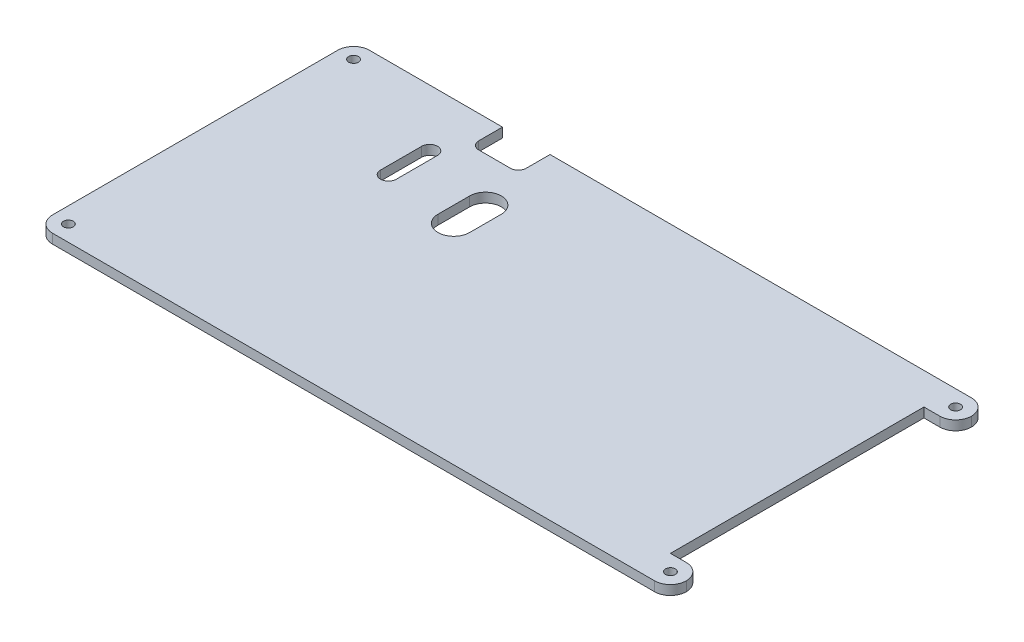
ISO-10303-21;
HEADER;
FILE_DESCRIPTION(('STEP AP214'),'2;1');
FILE_NAME('part.step','',(''),(''),'','','');
FILE_SCHEMA(('AUTOMOTIVE_DESIGN { 1 0 10303 214 1 1 1 1 }'));
ENDSEC;
DATA;
#1=APPLICATION_CONTEXT('core data for automotive mechanical design processes');
#2=APPLICATION_PROTOCOL_DEFINITION('international standard','automotive_design',2000,#1);
#3=PRODUCT_CONTEXT('',#1,'mechanical');
#4=PRODUCT('Part','Part','',(#3));
#5=PRODUCT_RELATED_PRODUCT_CATEGORY('part','',(#4));
#6=PRODUCT_DEFINITION_FORMATION('','',#4);
#7=PRODUCT_DEFINITION_CONTEXT('part definition',#1,'design');
#8=PRODUCT_DEFINITION('design','',#6,#7);
#9=PRODUCT_DEFINITION_SHAPE('','',#8);
#10=(LENGTH_UNIT() NAMED_UNIT(*) SI_UNIT(.MILLI.,.METRE.));
#11=(NAMED_UNIT(*) PLANE_ANGLE_UNIT() SI_UNIT($,.RADIAN.));
#12=(NAMED_UNIT(*) SI_UNIT($,.STERADIAN.) SOLID_ANGLE_UNIT());
#13=UNCERTAINTY_MEASURE_WITH_UNIT(LENGTH_MEASURE(1.E-05),#10,'distance_accuracy_value','');
#14=(GEOMETRIC_REPRESENTATION_CONTEXT(3) GLOBAL_UNCERTAINTY_ASSIGNED_CONTEXT((#13)) GLOBAL_UNIT_ASSIGNED_CONTEXT((#10,
#11,#12)) REPRESENTATION_CONTEXT('',''));
#15=CARTESIAN_POINT('',(0.,0.,0.));
#16=DIRECTION('',(0.,0.,1.));
#17=DIRECTION('',(1.,0.,0.));
#18=AXIS2_PLACEMENT_3D('',#15,#16,#17);
#19=CARTESIAN_POINT('',(-100.,3.,-50.));
#20=DIRECTION('',(0.,0.,-1.));
#21=DIRECTION('',(-1.,0.,0.));
#22=AXIS2_PLACEMENT_3D('',#19,#20,#21);
#23=PLANE('',#22);
#24=DIRECTION('',(0.,1.,0.));
#25=VECTOR('',#24,1.);
#26=CARTESIAN_POINT('',(-38.,0.,-50.));
#27=LINE('',#26,#25);
#28=CARTESIAN_POINT('',(-38.,0.,-50.));
#29=VERTEX_POINT('',#28);
#30=CARTESIAN_POINT('',(-38.,3.,-50.));
#31=VERTEX_POINT('',#30);
#32=EDGE_CURVE('E394',#29,#31,#27,.T.);
#33=ORIENTED_EDGE('',*,*,#32,.T.);
#34=DIRECTION('',(1.,0.,0.));
#35=VECTOR('',#34,1.);
#36=CARTESIAN_POINT('',(-100.,3.,-50.));
#37=LINE('',#36,#35);
#38=CARTESIAN_POINT('',(95.,3.,-50.));
#39=VERTEX_POINT('',#38);
#40=EDGE_CURVE('E426',#31,#39,#37,.T.);
#41=ORIENTED_EDGE('',*,*,#40,.T.);
#42=DIRECTION('',(0.,-1.,0.));
#43=VECTOR('',#42,1.);
#44=CARTESIAN_POINT('',(95.,3.,-50.));
#45=LINE('',#44,#43);
#46=CARTESIAN_POINT('',(95.,0.,-50.));
#47=VERTEX_POINT('',#46);
#48=EDGE_CURVE('E448',#39,#47,#45,.T.);
#49=ORIENTED_EDGE('',*,*,#48,.T.);
#50=DIRECTION('',(1.,0.,0.));
#51=VECTOR('',#50,1.);
#52=CARTESIAN_POINT('',(-100.,0.,-50.));
#53=LINE('',#52,#51);
#54=EDGE_CURVE('E440',#29,#47,#53,.T.);
#55=ORIENTED_EDGE('',*,*,#54,.F.);
#56=EDGE_LOOP('',(#33,#41,#49,#55));
#57=FACE_BOUND('',#56,.T.);
#58=ADVANCED_FACE('F48',(#57),#23,.T.);
#59=CARTESIAN_POINT('',(-100.,3.,-50.));
#60=DIRECTION('',(1.,0.,0.));
#61=DIRECTION('',(0.,0.,-1.));
#62=AXIS2_PLACEMENT_3D('',#59,#60,#61);
#63=PLANE('',#62);
#64=DIRECTION('',(0.,0.,1.));
#65=VECTOR('',#64,1.);
#66=CARTESIAN_POINT('',(-100.,0.,-50.));
#67=LINE('',#66,#65);
#68=CARTESIAN_POINT('',(-100.,0.,-45.));
#69=VERTEX_POINT('',#68);
#70=CARTESIAN_POINT('',(-100.,0.,45.));
#71=VERTEX_POINT('',#70);
#72=EDGE_CURVE('E430',#69,#71,#67,.T.);
#73=ORIENTED_EDGE('',*,*,#72,.T.);
#74=DIRECTION('',(0.,-1.,0.));
#75=VECTOR('',#74,1.);
#76=CARTESIAN_POINT('',(-100.,3.,45.));
#77=LINE('',#76,#75);
#78=CARTESIAN_POINT('',(-100.,3.,45.));
#79=VERTEX_POINT('',#78);
#80=EDGE_CURVE('E276',#71,#79,#77,.F.);
#81=ORIENTED_EDGE('',*,*,#80,.T.);
#82=DIRECTION('',(0.,0.,1.));
#83=VECTOR('',#82,1.);
#84=CARTESIAN_POINT('',(-100.,3.,-50.));
#85=LINE('',#84,#83);
#86=CARTESIAN_POINT('',(-100.,3.,-45.));
#87=VERTEX_POINT('',#86);
#88=EDGE_CURVE('E445',#87,#79,#85,.T.);
#89=ORIENTED_EDGE('',*,*,#88,.F.);
#90=DIRECTION('',(0.,-1.,0.));
#91=VECTOR('',#90,1.);
#92=CARTESIAN_POINT('',(-100.,0.,-45.));
#93=LINE('',#92,#91);
#94=EDGE_CURVE('E576',#87,#69,#93,.T.);
#95=ORIENTED_EDGE('',*,*,#94,.T.);
#96=EDGE_LOOP('',(#73,#81,#89,#95));
#97=FACE_BOUND('',#96,.T.);
#98=ADVANCED_FACE('F542',(#97),#63,.F.);
#99=CARTESIAN_POINT('',(-100.,3.,50.));
#100=DIRECTION('',(0.,0.,-1.));
#101=DIRECTION('',(-1.,0.,0.));
#102=AXIS2_PLACEMENT_3D('',#99,#100,#101);
#103=PLANE('',#102);
#104=DIRECTION('',(1.,0.,0.));
#105=VECTOR('',#104,1.);
#106=CARTESIAN_POINT('',(-100.,0.,50.));
#107=LINE('',#106,#105);
#108=CARTESIAN_POINT('',(-95.,0.,50.));
#109=VERTEX_POINT('',#108);
#110=CARTESIAN_POINT('',(95.,0.,50.));
#111=VERTEX_POINT('',#110);
#112=EDGE_CURVE('E435',#109,#111,#107,.T.);
#113=ORIENTED_EDGE('',*,*,#112,.T.);
#114=DIRECTION('',(0.,-1.,0.));
#115=VECTOR('',#114,1.);
#116=CARTESIAN_POINT('',(95.,3.,50.));
#117=LINE('',#116,#115);
#118=CARTESIAN_POINT('',(95.,3.,50.));
#119=VERTEX_POINT('',#118);
#120=EDGE_CURVE('E580',#111,#119,#117,.F.);
#121=ORIENTED_EDGE('',*,*,#120,.T.);
#122=DIRECTION('',(1.,0.,0.));
#123=VECTOR('',#122,1.);
#124=CARTESIAN_POINT('',(-100.,3.,50.));
#125=LINE('',#124,#123);
#126=CARTESIAN_POINT('',(-95.,3.,50.));
#127=VERTEX_POINT('',#126);
#128=EDGE_CURVE('E427',#127,#119,#125,.T.);
#129=ORIENTED_EDGE('',*,*,#128,.F.);
#130=DIRECTION('',(0.,-1.,0.));
#131=VECTOR('',#130,1.);
#132=CARTESIAN_POINT('',(-95.,3.,50.));
#133=LINE('',#132,#131);
#134=EDGE_CURVE('E583',#127,#109,#133,.T.);
#135=ORIENTED_EDGE('',*,*,#134,.T.);
#136=EDGE_LOOP('',(#113,#121,#129,#135));
#137=FACE_BOUND('',#136,.T.);
#138=ADVANCED_FACE('F550',(#137),#103,.F.);
#139=DIRECTION('',(0.,1.,0.));
#140=VECTOR('',#139,1.);
#141=CARTESIAN_POINT('',(-53.,0.,-50.));
#142=LINE('',#141,#140);
#143=CARTESIAN_POINT('',(-53.,0.,-50.));
#144=VERTEX_POINT('',#143);
#145=CARTESIAN_POINT('',(-53.,3.,-50.));
#146=VERTEX_POINT('',#145);
#147=EDGE_CURVE('E399',#144,#146,#142,.T.);
#148=ORIENTED_EDGE('',*,*,#147,.F.);
#149=CARTESIAN_POINT('',(-95.,0.,-50.));
#150=VERTEX_POINT('',#149);
#151=EDGE_CURVE('E441',#150,#144,#53,.T.);
#152=ORIENTED_EDGE('',*,*,#151,.F.);
#153=DIRECTION('',(0.,-1.,0.));
#154=VECTOR('',#153,1.);
#155=CARTESIAN_POINT('',(-95.,3.,-50.));
#156=LINE('',#155,#154);
#157=CARTESIAN_POINT('',(-95.,3.,-50.));
#158=VERTEX_POINT('',#157);
#159=EDGE_CURVE('E425',#150,#158,#156,.F.);
#160=ORIENTED_EDGE('',*,*,#159,.T.);
#161=EDGE_CURVE('E419',#158,#146,#37,.T.);
#162=ORIENTED_EDGE('',*,*,#161,.T.);
#163=EDGE_LOOP('',(#148,#152,#160,#162));
#164=FACE_BOUND('',#163,.T.);
#165=ADVANCED_FACE('F545',(#164),#23,.T.);
#166=CARTESIAN_POINT('',(0.,3.,0.));
#167=DIRECTION('',(0.,1.,0.));
#168=DIRECTION('',(0.,0.,1.));
#169=AXIS2_PLACEMENT_3D('',#166,#167,#168);
#170=PLANE('',#169);
#171=CARTESIAN_POINT('',(95.,3.,45.));
#172=DIRECTION('',(0.,1.,0.));
#173=DIRECTION('',(0.,0.,1.));
#174=AXIS2_PLACEMENT_3D('',#171,#172,#173);
#175=CIRCLE('',#174,5.);
#176=CARTESIAN_POINT('',(100.,3.,45.));
#177=VERTEX_POINT('',#176);
#178=EDGE_CURVE('E478',#119,#177,#175,.T.);
#179=ORIENTED_EDGE('',*,*,#178,.T.);
#180=CARTESIAN_POINT('',(95.,3.,45.));
#181=DIRECTION('',(0.,1.,0.));
#182=DIRECTION('',(0.,0.,1.));
#183=AXIS2_PLACEMENT_3D('',#180,#181,#182);
#184=CIRCLE('',#183,5.);
#185=CARTESIAN_POINT('',(95.,3.,40.));
#186=VERTEX_POINT('',#185);
#187=EDGE_CURVE('E275',#177,#186,#184,.T.);
#188=ORIENTED_EDGE('',*,*,#187,.T.);
#189=DIRECTION('',(1.,0.,0.));
#190=VECTOR('',#189,1.);
#191=CARTESIAN_POINT('',(100.,3.,40.));
#192=LINE('',#191,#190);
#193=CARTESIAN_POINT('',(90.,3.,40.));
#194=VERTEX_POINT('',#193);
#195=EDGE_CURVE('E252',#194,#186,#192,.T.);
#196=ORIENTED_EDGE('',*,*,#195,.F.);
#197=DIRECTION('',(0.,0.,1.));
#198=VECTOR('',#197,1.);
#199=CARTESIAN_POINT('',(90.,3.,-40.));
#200=LINE('',#199,#198);
#201=CARTESIAN_POINT('',(90.,3.,-40.));
#202=VERTEX_POINT('',#201);
#203=EDGE_CURVE('E229',#202,#194,#200,.T.);
#204=ORIENTED_EDGE('',*,*,#203,.F.);
#205=DIRECTION('',(-1.,0.,0.));
#206=VECTOR('',#205,1.);
#207=CARTESIAN_POINT('',(100.,3.,-40.));
#208=LINE('',#207,#206);
#209=CARTESIAN_POINT('',(95.,3.,-40.));
#210=VERTEX_POINT('',#209);
#211=EDGE_CURVE('E255',#210,#202,#208,.T.);
#212=ORIENTED_EDGE('',*,*,#211,.F.);
#213=CARTESIAN_POINT('',(95.,3.,-45.));
#214=DIRECTION('',(0.,1.,0.));
#215=DIRECTION('',(0.,0.,1.));
#216=AXIS2_PLACEMENT_3D('',#213,#214,#215);
#217=CIRCLE('',#216,5.);
#218=CARTESIAN_POINT('',(100.,3.,-45.));
#219=VERTEX_POINT('',#218);
#220=EDGE_CURVE('E270',#210,#219,#217,.T.);
#221=ORIENTED_EDGE('',*,*,#220,.T.);
#222=CARTESIAN_POINT('',(95.,3.,-45.));
#223=DIRECTION('',(0.,1.,0.));
#224=DIRECTION('',(0.,0.,1.));
#225=AXIS2_PLACEMENT_3D('',#222,#223,#224);
#226=CIRCLE('',#225,5.);
#227=EDGE_CURVE('E588',#219,#39,#226,.T.);
#228=ORIENTED_EDGE('',*,*,#227,.T.);
#229=ORIENTED_EDGE('',*,*,#40,.F.);
#230=DIRECTION('',(0.,0.,-1.));
#231=VECTOR('',#230,1.);
#232=CARTESIAN_POINT('',(-38.,3.,-40.));
#233=LINE('',#232,#231);
#234=CARTESIAN_POINT('',(-38.,3.,-42.5));
#235=VERTEX_POINT('',#234);
#236=EDGE_CURVE('E358',#235,#31,#233,.T.);
#237=ORIENTED_EDGE('',*,*,#236,.F.);
#238=CARTESIAN_POINT('',(-40.5,3.,-42.5));
#239=DIRECTION('',(0.,1.,0.));
#240=DIRECTION('',(0.,0.,1.));
#241=AXIS2_PLACEMENT_3D('',#238,#239,#240);
#242=CIRCLE('',#241,2.5);
#243=CARTESIAN_POINT('',(-40.5,3.,-40.));
#244=VERTEX_POINT('',#243);
#245=EDGE_CURVE('E632',#235,#244,#242,.F.);
#246=ORIENTED_EDGE('',*,*,#245,.T.);
#247=DIRECTION('',(1.,0.,0.));
#248=VECTOR('',#247,1.);
#249=CARTESIAN_POINT('',(-53.,3.,-40.));
#250=LINE('',#249,#248);
#251=CARTESIAN_POINT('',(-50.5,3.,-40.));
#252=VERTEX_POINT('',#251);
#253=EDGE_CURVE('E402',#252,#244,#250,.T.);
#254=ORIENTED_EDGE('',*,*,#253,.F.);
#255=CARTESIAN_POINT('',(-50.5,3.,-42.5));
#256=DIRECTION('',(0.,1.,0.));
#257=DIRECTION('',(0.,0.,1.));
#258=AXIS2_PLACEMENT_3D('',#255,#256,#257);
#259=CIRCLE('',#258,2.5);
#260=CARTESIAN_POINT('',(-53.,3.,-42.5));
#261=VERTEX_POINT('',#260);
#262=EDGE_CURVE('E57',#252,#261,#259,.F.);
#263=ORIENTED_EDGE('',*,*,#262,.T.);
#264=DIRECTION('',(0.,0.,1.));
#265=VECTOR('',#264,1.);
#266=CARTESIAN_POINT('',(-53.,3.,-40.));
#267=LINE('',#266,#265);
#268=EDGE_CURVE('E407',#146,#261,#267,.T.);
#269=ORIENTED_EDGE('',*,*,#268,.F.);
#270=ORIENTED_EDGE('',*,*,#161,.F.);
#271=CARTESIAN_POINT('',(-95.,3.,-45.));
#272=DIRECTION('',(0.,1.,0.));
#273=DIRECTION('',(0.,0.,1.));
#274=AXIS2_PLACEMENT_3D('',#271,#272,#273);
#275=CIRCLE('',#274,5.);
#276=EDGE_CURVE('E471',#158,#87,#275,.T.);
#277=ORIENTED_EDGE('',*,*,#276,.T.);
#278=ORIENTED_EDGE('',*,*,#88,.T.);
#279=CARTESIAN_POINT('',(-95.,3.,45.));
#280=DIRECTION('',(0.,1.,0.));
#281=DIRECTION('',(0.,0.,1.));
#282=AXIS2_PLACEMENT_3D('',#279,#280,#281);
#283=CIRCLE('',#282,5.);
#284=EDGE_CURVE('E475',#79,#127,#283,.T.);
#285=ORIENTED_EDGE('',*,*,#284,.T.);
#286=ORIENTED_EDGE('',*,*,#128,.T.);
#287=EDGE_LOOP('',(#179,#188,#196,#204,#212,#221,#228,#229,#237,#246,#254,#263,#269,#270,#277,
#278,#285,#286));
#288=FACE_BOUND('',#287,.T.);
#289=CARTESIAN_POINT('',(-58.,3.,-32.));
#290=DIRECTION('',(0.,1.,0.));
#291=DIRECTION('',(0.,0.,1.));
#292=AXIS2_PLACEMENT_3D('',#289,#290,#291);
#293=CIRCLE('',#292,2.50000000000001);
#294=CARTESIAN_POINT('',(-55.5,3.,-32.));
#295=VERTEX_POINT('',#294);
#296=CARTESIAN_POINT('',(-60.5,3.,-32.));
#297=VERTEX_POINT('',#296);
#298=EDGE_CURVE('E259',#295,#297,#293,.T.);
#299=ORIENTED_EDGE('',*,*,#298,.F.);
#300=DIRECTION('',(0.,0.,-1.));
#301=VECTOR('',#300,1.);
#302=CARTESIAN_POINT('',(-55.5,3.,-32.));
#303=LINE('',#302,#301);
#304=CARTESIAN_POINT('',(-55.5,3.,-19.));
#305=VERTEX_POINT('',#304);
#306=EDGE_CURVE('E305',#305,#295,#303,.T.);
#307=ORIENTED_EDGE('',*,*,#306,.F.);
#308=CARTESIAN_POINT('',(-58.,3.,-19.));
#309=DIRECTION('',(0.,1.,0.));
#310=DIRECTION('',(0.,0.,1.));
#311=AXIS2_PLACEMENT_3D('',#308,#309,#310);
#312=CIRCLE('',#311,2.50000000000001);
#313=CARTESIAN_POINT('',(-60.5,3.,-19.));
#314=VERTEX_POINT('',#313);
#315=EDGE_CURVE('E310',#314,#305,#312,.T.);
#316=ORIENTED_EDGE('',*,*,#315,.F.);
#317=DIRECTION('',(0.,0.,1.));
#318=VECTOR('',#317,1.);
#319=CARTESIAN_POINT('',(-60.5,3.,-32.));
#320=LINE('',#319,#318);
#321=EDGE_CURVE('E323',#297,#314,#320,.T.);
#322=ORIENTED_EDGE('',*,*,#321,.F.);
#323=EDGE_LOOP('',(#299,#307,#316,#322));
#324=FACE_BOUND('',#323,.T.);
#325=CARTESIAN_POINT('',(-34.365,3.,-26.));
#326=DIRECTION('',(0.,1.,0.));
#327=DIRECTION('',(0.,0.,1.));
#328=AXIS2_PLACEMENT_3D('',#325,#326,#327);
#329=CIRCLE('',#328,5.);
#330=CARTESIAN_POINT('',(-29.365,3.,-26.));
#331=VERTEX_POINT('',#330);
#332=CARTESIAN_POINT('',(-39.365,3.,-26.));
#333=VERTEX_POINT('',#332);
#334=EDGE_CURVE('E304',#331,#333,#329,.T.);
#335=ORIENTED_EDGE('',*,*,#334,.F.);
#336=DIRECTION('',(0.,0.,-1.));
#337=VECTOR('',#336,1.);
#338=CARTESIAN_POINT('',(-29.365,3.,-26.));
#339=LINE('',#338,#337);
#340=CARTESIAN_POINT('',(-29.365,3.,-16.));
#341=VERTEX_POINT('',#340);
#342=EDGE_CURVE('E359',#341,#331,#339,.T.);
#343=ORIENTED_EDGE('',*,*,#342,.F.);
#344=CARTESIAN_POINT('',(-34.365,3.,-16.));
#345=DIRECTION('',(0.,1.,0.));
#346=DIRECTION('',(0.,0.,1.));
#347=AXIS2_PLACEMENT_3D('',#344,#345,#346);
#348=CIRCLE('',#347,5.);
#349=CARTESIAN_POINT('',(-39.365,3.,-16.));
#350=VERTEX_POINT('',#349);
#351=EDGE_CURVE('E364',#350,#341,#348,.T.);
#352=ORIENTED_EDGE('',*,*,#351,.F.);
#353=DIRECTION('',(0.,0.,1.));
#354=VECTOR('',#353,1.);
#355=CARTESIAN_POINT('',(-39.365,3.,-26.));
#356=LINE('',#355,#354);
#357=EDGE_CURVE('E373',#333,#350,#356,.T.);
#358=ORIENTED_EDGE('',*,*,#357,.F.);
#359=EDGE_LOOP('',(#335,#343,#352,#358));
#360=FACE_BOUND('',#359,.T.);
#361=CARTESIAN_POINT('',(-95.,3.,45.));
#362=DIRECTION('',(0.,1.,0.));
#363=DIRECTION('',(0.,0.,1.));
#364=AXIS2_PLACEMENT_3D('',#361,#362,#363);
#365=CIRCLE('',#364,1.54999999999999);
#366=CARTESIAN_POINT('',(-95.,3.,46.55));
#367=VERTEX_POINT('',#366);
#368=EDGE_CURVE('E489',#367,#367,#365,.T.);
#369=ORIENTED_EDGE('',*,*,#368,.F.);
#370=EDGE_LOOP('',(#369));
#371=FACE_BOUND('',#370,.T.);
#372=CARTESIAN_POINT('',(95.,3.,-45.));
#373=DIRECTION('',(0.,1.,0.));
#374=DIRECTION('',(0.,0.,1.));
#375=AXIS2_PLACEMENT_3D('',#372,#373,#374);
#376=CIRCLE('',#375,1.54999999999999);
#377=CARTESIAN_POINT('',(95.,3.,-43.45));
#378=VERTEX_POINT('',#377);
#379=EDGE_CURVE('E497',#378,#378,#376,.T.);
#380=ORIENTED_EDGE('',*,*,#379,.F.);
#381=EDGE_LOOP('',(#380));
#382=FACE_BOUND('',#381,.T.);
#383=CARTESIAN_POINT('',(95.,3.,45.));
#384=DIRECTION('',(0.,1.,0.));
#385=DIRECTION('',(0.,0.,1.));
#386=AXIS2_PLACEMENT_3D('',#383,#384,#385);
#387=CIRCLE('',#386,1.54999999999999);
#388=CARTESIAN_POINT('',(95.,3.,46.55));
#389=VERTEX_POINT('',#388);
#390=EDGE_CURVE('E498',#389,#389,#387,.T.);
#391=ORIENTED_EDGE('',*,*,#390,.F.);
#392=EDGE_LOOP('',(#391));
#393=FACE_BOUND('',#392,.T.);
#394=CARTESIAN_POINT('',(-95.,3.,-45.));
#395=DIRECTION('',(0.,1.,0.));
#396=DIRECTION('',(0.,0.,1.));
#397=AXIS2_PLACEMENT_3D('',#394,#395,#396);
#398=CIRCLE('',#397,1.54999999999999);
#399=CARTESIAN_POINT('',(-95.,3.,-43.45));
#400=VERTEX_POINT('',#399);
#401=EDGE_CURVE('E484',#400,#400,#398,.T.);
#402=ORIENTED_EDGE('',*,*,#401,.F.);
#403=EDGE_LOOP('',(#402));
#404=FACE_BOUND('',#403,.T.);
#405=ADVANCED_FACE('F555',(#288,#324,#360,#371,#382,#393,#404),#170,.T.);
#406=CARTESIAN_POINT('',(0.,0.,0.));
#407=DIRECTION('',(0.,1.,0.));
#408=DIRECTION('',(0.,0.,1.));
#409=AXIS2_PLACEMENT_3D('',#406,#407,#408);
#410=PLANE('',#409);
#411=DIRECTION('',(0.,0.,-1.));
#412=VECTOR('',#411,1.);
#413=CARTESIAN_POINT('',(-55.5,0.,-32.));
#414=LINE('',#413,#412);
#415=CARTESIAN_POINT('',(-55.5,0.,-19.));
#416=VERTEX_POINT('',#415);
#417=CARTESIAN_POINT('',(-55.5,0.,-32.));
#418=VERTEX_POINT('',#417);
#419=EDGE_CURVE('E294',#416,#418,#414,.T.);
#420=ORIENTED_EDGE('',*,*,#419,.T.);
#421=CARTESIAN_POINT('',(-58.,0.,-32.));
#422=DIRECTION('',(0.,1.,0.));
#423=DIRECTION('',(0.,0.,1.));
#424=AXIS2_PLACEMENT_3D('',#421,#422,#423);
#425=CIRCLE('',#424,2.50000000000001);
#426=CARTESIAN_POINT('',(-60.5,0.,-32.));
#427=VERTEX_POINT('',#426);
#428=EDGE_CURVE('E311',#418,#427,#425,.T.);
#429=ORIENTED_EDGE('',*,*,#428,.T.);
#430=DIRECTION('',(0.,0.,1.));
#431=VECTOR('',#430,1.);
#432=CARTESIAN_POINT('',(-60.5,0.,-32.));
#433=LINE('',#432,#431);
#434=CARTESIAN_POINT('',(-60.5,0.,-19.));
#435=VERTEX_POINT('',#434);
#436=EDGE_CURVE('E337',#427,#435,#433,.T.);
#437=ORIENTED_EDGE('',*,*,#436,.T.);
#438=CARTESIAN_POINT('',(-58.,0.,-19.));
#439=DIRECTION('',(0.,1.,0.));
#440=DIRECTION('',(0.,0.,1.));
#441=AXIS2_PLACEMENT_3D('',#438,#439,#440);
#442=CIRCLE('',#441,2.50000000000001);
#443=EDGE_CURVE('E333',#435,#416,#442,.T.);
#444=ORIENTED_EDGE('',*,*,#443,.T.);
#445=EDGE_LOOP('',(#420,#429,#437,#444));
#446=FACE_BOUND('',#445,.T.);
#447=DIRECTION('',(0.,0.,-1.));
#448=VECTOR('',#447,1.);
#449=CARTESIAN_POINT('',(-29.365,0.,-26.));
#450=LINE('',#449,#448);
#451=CARTESIAN_POINT('',(-29.365,0.,-16.));
#452=VERTEX_POINT('',#451);
#453=CARTESIAN_POINT('',(-29.365,0.,-26.));
#454=VERTEX_POINT('',#453);
#455=EDGE_CURVE('E348',#452,#454,#450,.T.);
#456=ORIENTED_EDGE('',*,*,#455,.T.);
#457=CARTESIAN_POINT('',(-34.365,0.,-26.));
#458=DIRECTION('',(0.,1.,0.));
#459=DIRECTION('',(0.,0.,1.));
#460=AXIS2_PLACEMENT_3D('',#457,#458,#459);
#461=CIRCLE('',#460,5.);
#462=CARTESIAN_POINT('',(-39.365,0.,-26.));
#463=VERTEX_POINT('',#462);
#464=EDGE_CURVE('E365',#454,#463,#461,.T.);
#465=ORIENTED_EDGE('',*,*,#464,.T.);
#466=DIRECTION('',(0.,0.,1.));
#467=VECTOR('',#466,1.);
#468=CARTESIAN_POINT('',(-39.365,0.,-26.));
#469=LINE('',#468,#467);
#470=CARTESIAN_POINT('',(-39.365,0.,-16.));
#471=VERTEX_POINT('',#470);
#472=EDGE_CURVE('E387',#463,#471,#469,.T.);
#473=ORIENTED_EDGE('',*,*,#472,.T.);
#474=CARTESIAN_POINT('',(-34.365,0.,-16.));
#475=DIRECTION('',(0.,1.,0.));
#476=DIRECTION('',(0.,0.,1.));
#477=AXIS2_PLACEMENT_3D('',#474,#475,#476);
#478=CIRCLE('',#477,5.);
#479=EDGE_CURVE('E383',#471,#452,#478,.T.);
#480=ORIENTED_EDGE('',*,*,#479,.T.);
#481=EDGE_LOOP('',(#456,#465,#473,#480));
#482=FACE_BOUND('',#481,.T.);
#483=CARTESIAN_POINT('',(-95.,0.,45.));
#484=DIRECTION('',(0.,1.,0.));
#485=DIRECTION('',(0.,0.,1.));
#486=AXIS2_PLACEMENT_3D('',#483,#484,#485);
#487=CIRCLE('',#486,1.54999999999999);
#488=CARTESIAN_POINT('',(-95.,0.,46.55));
#489=VERTEX_POINT('',#488);
#490=EDGE_CURVE('E503',#489,#489,#487,.T.);
#491=ORIENTED_EDGE('',*,*,#490,.T.);
#492=EDGE_LOOP('',(#491));
#493=FACE_BOUND('',#492,.T.);
#494=CARTESIAN_POINT('',(95.,0.,-45.));
#495=DIRECTION('',(0.,1.,0.));
#496=DIRECTION('',(0.,0.,1.));
#497=AXIS2_PLACEMENT_3D('',#494,#495,#496);
#498=CIRCLE('',#497,1.54999999999999);
#499=CARTESIAN_POINT('',(95.,0.,-43.45));
#500=VERTEX_POINT('',#499);
#501=EDGE_CURVE('E493',#500,#500,#498,.T.);
#502=ORIENTED_EDGE('',*,*,#501,.T.);
#503=EDGE_LOOP('',(#502));
#504=FACE_BOUND('',#503,.T.);
#505=CARTESIAN_POINT('',(95.,0.,45.));
#506=DIRECTION('',(0.,1.,0.));
#507=DIRECTION('',(0.,0.,1.));
#508=AXIS2_PLACEMENT_3D('',#505,#506,#507);
#509=CIRCLE('',#508,1.54999999999999);
#510=CARTESIAN_POINT('',(95.,0.,46.55));
#511=VERTEX_POINT('',#510);
#512=EDGE_CURVE('E234',#511,#511,#509,.T.);
#513=ORIENTED_EDGE('',*,*,#512,.T.);
#514=EDGE_LOOP('',(#513));
#515=FACE_BOUND('',#514,.T.);
#516=CARTESIAN_POINT('',(-95.,0.,-45.));
#517=DIRECTION('',(0.,1.,0.));
#518=DIRECTION('',(0.,0.,1.));
#519=AXIS2_PLACEMENT_3D('',#516,#517,#518);
#520=CIRCLE('',#519,1.54999999999999);
#521=CARTESIAN_POINT('',(-95.,0.,-43.45));
#522=VERTEX_POINT('',#521);
#523=EDGE_CURVE('E436',#522,#522,#520,.T.);
#524=ORIENTED_EDGE('',*,*,#523,.T.);
#525=EDGE_LOOP('',(#524));
#526=FACE_BOUND('',#525,.T.);
#527=DIRECTION('',(1.,0.,0.));
#528=VECTOR('',#527,1.);
#529=CARTESIAN_POINT('',(100.,0.,40.));
#530=LINE('',#529,#528);
#531=CARTESIAN_POINT('',(90.,0.,40.));
#532=VERTEX_POINT('',#531);
#533=CARTESIAN_POINT('',(95.,0.,40.));
#534=VERTEX_POINT('',#533);
#535=EDGE_CURVE('E238',#532,#534,#530,.T.);
#536=ORIENTED_EDGE('',*,*,#535,.T.);
#537=CARTESIAN_POINT('',(95.,0.,45.));
#538=DIRECTION('',(0.,1.,0.));
#539=DIRECTION('',(0.,0.,1.));
#540=AXIS2_PLACEMENT_3D('',#537,#538,#539);
#541=CIRCLE('',#540,5.);
#542=CARTESIAN_POINT('',(100.,0.,45.));
#543=VERTEX_POINT('',#542);
#544=EDGE_CURVE('E607',#534,#543,#541,.F.);
#545=ORIENTED_EDGE('',*,*,#544,.T.);
#546=CARTESIAN_POINT('',(95.,0.,45.));
#547=DIRECTION('',(0.,1.,0.));
#548=DIRECTION('',(0.,0.,1.));
#549=AXIS2_PLACEMENT_3D('',#546,#547,#548);
#550=CIRCLE('',#549,5.);
#551=EDGE_CURVE('E458',#543,#111,#550,.F.);
#552=ORIENTED_EDGE('',*,*,#551,.T.);
#553=ORIENTED_EDGE('',*,*,#112,.F.);
#554=CARTESIAN_POINT('',(-95.,0.,45.));
#555=DIRECTION('',(0.,1.,0.));
#556=DIRECTION('',(0.,0.,1.));
#557=AXIS2_PLACEMENT_3D('',#554,#555,#556);
#558=CIRCLE('',#557,5.);
#559=EDGE_CURVE('E455',#109,#71,#558,.F.);
#560=ORIENTED_EDGE('',*,*,#559,.T.);
#561=ORIENTED_EDGE('',*,*,#72,.F.);
#562=CARTESIAN_POINT('',(-95.,0.,-45.));
#563=DIRECTION('',(0.,1.,0.));
#564=DIRECTION('',(0.,0.,1.));
#565=AXIS2_PLACEMENT_3D('',#562,#563,#564);
#566=CIRCLE('',#565,5.);
#567=EDGE_CURVE('E452',#69,#150,#566,.F.);
#568=ORIENTED_EDGE('',*,*,#567,.T.);
#569=ORIENTED_EDGE('',*,*,#151,.T.);
#570=DIRECTION('',(0.,0.,1.));
#571=VECTOR('',#570,1.);
#572=CARTESIAN_POINT('',(-53.,0.,-40.));
#573=LINE('',#572,#571);
#574=CARTESIAN_POINT('',(-53.,0.,-42.5));
#575=VERTEX_POINT('',#574);
#576=EDGE_CURVE('E568',#144,#575,#573,.T.);
#577=ORIENTED_EDGE('',*,*,#576,.T.);
#578=CARTESIAN_POINT('',(-50.5,0.,-42.5));
#579=DIRECTION('',(0.,1.,0.));
#580=DIRECTION('',(0.,0.,1.));
#581=AXIS2_PLACEMENT_3D('',#578,#579,#580);
#582=CIRCLE('',#581,2.5);
#583=CARTESIAN_POINT('',(-50.5,0.,-40.));
#584=VERTEX_POINT('',#583);
#585=EDGE_CURVE('E12',#575,#584,#582,.T.);
#586=ORIENTED_EDGE('',*,*,#585,.T.);
#587=DIRECTION('',(1.,0.,0.));
#588=VECTOR('',#587,1.);
#589=CARTESIAN_POINT('',(-53.,0.,-40.));
#590=LINE('',#589,#588);
#591=CARTESIAN_POINT('',(-40.5,0.,-40.));
#592=VERTEX_POINT('',#591);
#593=EDGE_CURVE('E398',#584,#592,#590,.T.);
#594=ORIENTED_EDGE('',*,*,#593,.T.);
#595=CARTESIAN_POINT('',(-40.5,0.,-42.5));
#596=DIRECTION('',(0.,1.,0.));
#597=DIRECTION('',(0.,0.,1.));
#598=AXIS2_PLACEMENT_3D('',#595,#596,#597);
#599=CIRCLE('',#598,2.5);
#600=CARTESIAN_POINT('',(-38.,0.,-42.5));
#601=VERTEX_POINT('',#600);
#602=EDGE_CURVE('E635',#592,#601,#599,.T.);
#603=ORIENTED_EDGE('',*,*,#602,.T.);
#604=DIRECTION('',(0.,0.,-1.));
#605=VECTOR('',#604,1.);
#606=CARTESIAN_POINT('',(-38.,0.,-40.));
#607=LINE('',#606,#605);
#608=EDGE_CURVE('E408',#601,#29,#607,.T.);
#609=ORIENTED_EDGE('',*,*,#608,.T.);
#610=ORIENTED_EDGE('',*,*,#54,.T.);
#611=CARTESIAN_POINT('',(95.,0.,-45.));
#612=DIRECTION('',(0.,1.,0.));
#613=DIRECTION('',(0.,0.,1.));
#614=AXIS2_PLACEMENT_3D('',#611,#612,#613);
#615=CIRCLE('',#614,5.);
#616=CARTESIAN_POINT('',(100.,0.,-45.));
#617=VERTEX_POINT('',#616);
#618=EDGE_CURVE('E461',#47,#617,#615,.F.);
#619=ORIENTED_EDGE('',*,*,#618,.T.);
#620=CARTESIAN_POINT('',(95.,0.,-45.));
#621=DIRECTION('',(0.,1.,0.));
#622=DIRECTION('',(0.,0.,1.));
#623=AXIS2_PLACEMENT_3D('',#620,#621,#622);
#624=CIRCLE('',#623,5.);
#625=CARTESIAN_POINT('',(95.,0.,-40.));
#626=VERTEX_POINT('',#625);
#627=EDGE_CURVE('E609',#617,#626,#624,.F.);
#628=ORIENTED_EDGE('',*,*,#627,.T.);
#629=DIRECTION('',(-1.,0.,0.));
#630=VECTOR('',#629,1.);
#631=CARTESIAN_POINT('',(100.,0.,-40.));
#632=LINE('',#631,#630);
#633=CARTESIAN_POINT('',(90.,0.,-40.));
#634=VERTEX_POINT('',#633);
#635=EDGE_CURVE('E248',#626,#634,#632,.T.);
#636=ORIENTED_EDGE('',*,*,#635,.T.);
#637=DIRECTION('',(0.,0.,1.));
#638=VECTOR('',#637,1.);
#639=CARTESIAN_POINT('',(90.,0.,-40.));
#640=LINE('',#639,#638);
#641=EDGE_CURVE('E226',#634,#532,#640,.T.);
#642=ORIENTED_EDGE('',*,*,#641,.T.);
#643=EDGE_LOOP('',(#536,#545,#552,#553,#560,#561,#568,#569,#577,#586,#594,#603,#609,#610,#619,
#628,#636,#642));
#644=FACE_BOUND('',#643,.T.);
#645=ADVANCED_FACE('F246',(#446,#482,#493,#504,#515,#526,#644),#410,.F.);
#646=CARTESIAN_POINT('',(-95.,0.,-45.));
#647=DIRECTION('',(0.,1.,0.));
#648=DIRECTION('',(0.,0.,1.));
#649=AXIS2_PLACEMENT_3D('',#646,#647,#648);
#650=CYLINDRICAL_SURFACE('',#649,1.54999999999999);
#651=ORIENTED_EDGE('',*,*,#523,.F.);
#652=EDGE_LOOP('',(#651));
#653=FACE_BOUND('',#652,.T.);
#654=ORIENTED_EDGE('',*,*,#401,.T.);
#655=EDGE_LOOP('',(#654));
#656=FACE_BOUND('',#655,.T.);
#657=ADVANCED_FACE('F723',(#653,#656),#650,.F.);
#658=CARTESIAN_POINT('',(95.,0.,45.));
#659=DIRECTION('',(0.,1.,0.));
#660=DIRECTION('',(0.,0.,1.));
#661=AXIS2_PLACEMENT_3D('',#658,#659,#660);
#662=CYLINDRICAL_SURFACE('',#661,1.54999999999999);
#663=ORIENTED_EDGE('',*,*,#512,.F.);
#664=EDGE_LOOP('',(#663));
#665=FACE_BOUND('',#664,.T.);
#666=ORIENTED_EDGE('',*,*,#390,.T.);
#667=EDGE_LOOP('',(#666));
#668=FACE_BOUND('',#667,.T.);
#669=ADVANCED_FACE('F537',(#665,#668),#662,.F.);
#670=CARTESIAN_POINT('',(95.,0.,-45.));
#671=DIRECTION('',(0.,1.,0.));
#672=DIRECTION('',(0.,0.,1.));
#673=AXIS2_PLACEMENT_3D('',#670,#671,#672);
#674=CYLINDRICAL_SURFACE('',#673,1.54999999999999);
#675=ORIENTED_EDGE('',*,*,#501,.F.);
#676=EDGE_LOOP('',(#675));
#677=FACE_BOUND('',#676,.T.);
#678=ORIENTED_EDGE('',*,*,#379,.T.);
#679=EDGE_LOOP('',(#678));
#680=FACE_BOUND('',#679,.T.);
#681=ADVANCED_FACE('F527',(#677,#680),#674,.F.);
#682=CARTESIAN_POINT('',(-95.,0.,45.));
#683=DIRECTION('',(0.,1.,0.));
#684=DIRECTION('',(0.,0.,1.));
#685=AXIS2_PLACEMENT_3D('',#682,#683,#684);
#686=CYLINDRICAL_SURFACE('',#685,1.54999999999999);
#687=ORIENTED_EDGE('',*,*,#490,.F.);
#688=EDGE_LOOP('',(#687));
#689=FACE_BOUND('',#688,.T.);
#690=ORIENTED_EDGE('',*,*,#368,.T.);
#691=EDGE_LOOP('',(#690));
#692=FACE_BOUND('',#691,.T.);
#693=ADVANCED_FACE('F524',(#689,#692),#686,.F.);
#694=CARTESIAN_POINT('',(95.,3.,-45.));
#695=DIRECTION('',(0.,-1.,0.));
#696=DIRECTION('',(0.,0.,-1.));
#697=AXIS2_PLACEMENT_3D('',#694,#695,#696);
#698=CYLINDRICAL_SURFACE('',#697,5.);
#699=ORIENTED_EDGE('',*,*,#227,.F.);
#700=DIRECTION('',(0.,-1.,0.));
#701=VECTOR('',#700,1.);
#702=CARTESIAN_POINT('',(100.,3.,-45.));
#703=LINE('',#702,#701);
#704=EDGE_CURVE('E468',#617,#219,#703,.F.);
#705=ORIENTED_EDGE('',*,*,#704,.F.);
#706=ORIENTED_EDGE('',*,*,#618,.F.);
#707=ORIENTED_EDGE('',*,*,#48,.F.);
#708=EDGE_LOOP('',(#699,#705,#706,#707));
#709=FACE_BOUND('',#708,.T.);
#710=ADVANCED_FACE('F526',(#709),#698,.T.);
#711=CARTESIAN_POINT('',(95.,3.,45.));
#712=DIRECTION('',(0.,1.,0.));
#713=DIRECTION('',(0.,0.,1.));
#714=AXIS2_PLACEMENT_3D('',#711,#712,#713);
#715=CYLINDRICAL_SURFACE('',#714,5.);
#716=ORIENTED_EDGE('',*,*,#178,.F.);
#717=ORIENTED_EDGE('',*,*,#120,.F.);
#718=ORIENTED_EDGE('',*,*,#551,.F.);
#719=DIRECTION('',(0.,-1.,0.));
#720=VECTOR('',#719,1.);
#721=CARTESIAN_POINT('',(100.,0.,45.));
#722=LINE('',#721,#720);
#723=EDGE_CURVE('E464',#177,#543,#722,.T.);
#724=ORIENTED_EDGE('',*,*,#723,.F.);
#725=EDGE_LOOP('',(#716,#717,#718,#724));
#726=FACE_BOUND('',#725,.T.);
#727=ADVANCED_FACE('F534',(#726),#715,.T.);
#728=CARTESIAN_POINT('',(-95.,3.,45.));
#729=DIRECTION('',(0.,-1.,0.));
#730=DIRECTION('',(0.,0.,-1.));
#731=AXIS2_PLACEMENT_3D('',#728,#729,#730);
#732=CYLINDRICAL_SURFACE('',#731,5.);
#733=ORIENTED_EDGE('',*,*,#284,.F.);
#734=ORIENTED_EDGE('',*,*,#80,.F.);
#735=ORIENTED_EDGE('',*,*,#559,.F.);
#736=ORIENTED_EDGE('',*,*,#134,.F.);
#737=EDGE_LOOP('',(#733,#734,#735,#736));
#738=FACE_BOUND('',#737,.T.);
#739=ADVANCED_FACE('F672',(#738),#732,.T.);
#740=CARTESIAN_POINT('',(-95.,3.,-45.));
#741=DIRECTION('',(0.,1.,0.));
#742=DIRECTION('',(0.,0.,1.));
#743=AXIS2_PLACEMENT_3D('',#740,#741,#742);
#744=CYLINDRICAL_SURFACE('',#743,5.);
#745=ORIENTED_EDGE('',*,*,#276,.F.);
#746=ORIENTED_EDGE('',*,*,#159,.F.);
#747=ORIENTED_EDGE('',*,*,#567,.F.);
#748=ORIENTED_EDGE('',*,*,#94,.F.);
#749=EDGE_LOOP('',(#745,#746,#747,#748));
#750=FACE_BOUND('',#749,.T.);
#751=ADVANCED_FACE('F575',(#750),#744,.T.);
#752=CARTESIAN_POINT('',(-38.,0.,-40.));
#753=DIRECTION('',(1.,0.,0.));
#754=DIRECTION('',(0.,0.,-1.));
#755=AXIS2_PLACEMENT_3D('',#752,#753,#754);
#756=PLANE('',#755);
#757=ORIENTED_EDGE('',*,*,#608,.F.);
#758=DIRECTION('',(0.,1.,0.));
#759=VECTOR('',#758,1.);
#760=CARTESIAN_POINT('',(-38.,3.,-42.5));
#761=LINE('',#760,#759);
#762=EDGE_CURVE('E619',#601,#235,#761,.T.);
#763=ORIENTED_EDGE('',*,*,#762,.T.);
#764=ORIENTED_EDGE('',*,*,#236,.T.);
#765=ORIENTED_EDGE('',*,*,#32,.F.);
#766=EDGE_LOOP('',(#757,#763,#764,#765));
#767=FACE_BOUND('',#766,.T.);
#768=ADVANCED_FACE('F647',(#767),#756,.F.);
#769=CARTESIAN_POINT('',(-53.,0.,-40.));
#770=DIRECTION('',(0.,0.,1.));
#771=DIRECTION('',(1.,0.,0.));
#772=AXIS2_PLACEMENT_3D('',#769,#770,#771);
#773=PLANE('',#772);
#774=ORIENTED_EDGE('',*,*,#253,.T.);
#775=DIRECTION('',(0.,1.,0.));
#776=VECTOR('',#775,1.);
#777=CARTESIAN_POINT('',(-40.5,0.,-40.));
#778=LINE('',#777,#776);
#779=EDGE_CURVE('E627',#244,#592,#778,.F.);
#780=ORIENTED_EDGE('',*,*,#779,.T.);
#781=ORIENTED_EDGE('',*,*,#593,.F.);
#782=DIRECTION('',(0.,1.,0.));
#783=VECTOR('',#782,1.);
#784=CARTESIAN_POINT('',(-50.5,3.,-40.));
#785=LINE('',#784,#783);
#786=EDGE_CURVE('E623',#584,#252,#785,.T.);
#787=ORIENTED_EDGE('',*,*,#786,.T.);
#788=EDGE_LOOP('',(#774,#780,#781,#787));
#789=FACE_BOUND('',#788,.T.);
#790=ADVANCED_FACE('F653',(#789),#773,.F.);
#791=CARTESIAN_POINT('',(-53.,0.,-40.));
#792=DIRECTION('',(-1.,0.,0.));
#793=DIRECTION('',(0.,0.,1.));
#794=AXIS2_PLACEMENT_3D('',#791,#792,#793);
#795=PLANE('',#794);
#796=ORIENTED_EDGE('',*,*,#268,.T.);
#797=DIRECTION('',(0.,1.,0.));
#798=VECTOR('',#797,1.);
#799=CARTESIAN_POINT('',(-53.,0.,-42.5));
#800=LINE('',#799,#798);
#801=EDGE_CURVE('E64',#261,#575,#800,.F.);
#802=ORIENTED_EDGE('',*,*,#801,.T.);
#803=ORIENTED_EDGE('',*,*,#576,.F.);
#804=ORIENTED_EDGE('',*,*,#147,.T.);
#805=EDGE_LOOP('',(#796,#802,#803,#804));
#806=FACE_BOUND('',#805,.T.);
#807=ADVANCED_FACE('F739',(#806),#795,.F.);
#808=CARTESIAN_POINT('',(-34.365,0.,-26.));
#809=DIRECTION('',(0.,1.,0.));
#810=DIRECTION('',(0.,0.,1.));
#811=AXIS2_PLACEMENT_3D('',#808,#809,#810);
#812=CYLINDRICAL_SURFACE('',#811,5.);
#813=ORIENTED_EDGE('',*,*,#334,.T.);
#814=DIRECTION('',(0.,1.,0.));
#815=VECTOR('',#814,1.);
#816=CARTESIAN_POINT('',(-39.365,0.,-26.));
#817=LINE('',#816,#815);
#818=EDGE_CURVE('E344',#463,#333,#817,.T.);
#819=ORIENTED_EDGE('',*,*,#818,.F.);
#820=ORIENTED_EDGE('',*,*,#464,.F.);
#821=DIRECTION('',(0.,1.,0.));
#822=VECTOR('',#821,1.);
#823=CARTESIAN_POINT('',(-29.365,0.,-26.));
#824=LINE('',#823,#822);
#825=EDGE_CURVE('E355',#454,#331,#824,.T.);
#826=ORIENTED_EDGE('',*,*,#825,.T.);
#827=EDGE_LOOP('',(#813,#819,#820,#826));
#828=FACE_BOUND('',#827,.T.);
#829=ADVANCED_FACE('F746',(#828),#812,.F.);
#830=CARTESIAN_POINT('',(-29.365,0.,-26.));
#831=DIRECTION('',(1.,0.,0.));
#832=DIRECTION('',(0.,0.,-1.));
#833=AXIS2_PLACEMENT_3D('',#830,#831,#832);
#834=PLANE('',#833);
#835=ORIENTED_EDGE('',*,*,#342,.T.);
#836=ORIENTED_EDGE('',*,*,#825,.F.);
#837=ORIENTED_EDGE('',*,*,#455,.F.);
#838=DIRECTION('',(0.,1.,0.));
#839=VECTOR('',#838,1.);
#840=CARTESIAN_POINT('',(-29.365,0.,-16.));
#841=LINE('',#840,#839);
#842=EDGE_CURVE('E352',#452,#341,#841,.T.);
#843=ORIENTED_EDGE('',*,*,#842,.T.);
#844=EDGE_LOOP('',(#835,#836,#837,#843));
#845=FACE_BOUND('',#844,.T.);
#846=ADVANCED_FACE('F757',(#845),#834,.F.);
#847=CARTESIAN_POINT('',(-34.365,0.,-16.));
#848=DIRECTION('',(0.,1.,0.));
#849=DIRECTION('',(0.,0.,1.));
#850=AXIS2_PLACEMENT_3D('',#847,#848,#849);
#851=CYLINDRICAL_SURFACE('',#850,5.);
#852=ORIENTED_EDGE('',*,*,#351,.T.);
#853=ORIENTED_EDGE('',*,*,#842,.F.);
#854=ORIENTED_EDGE('',*,*,#479,.F.);
#855=DIRECTION('',(0.,1.,0.));
#856=VECTOR('',#855,1.);
#857=CARTESIAN_POINT('',(-39.365,0.,-16.));
#858=LINE('',#857,#856);
#859=EDGE_CURVE('E349',#471,#350,#858,.T.);
#860=ORIENTED_EDGE('',*,*,#859,.T.);
#861=EDGE_LOOP('',(#852,#853,#854,#860));
#862=FACE_BOUND('',#861,.T.);
#863=ADVANCED_FACE('F767',(#862),#851,.F.);
#864=CARTESIAN_POINT('',(-39.365,0.,-26.));
#865=DIRECTION('',(-1.,0.,0.));
#866=DIRECTION('',(0.,0.,1.));
#867=AXIS2_PLACEMENT_3D('',#864,#865,#866);
#868=PLANE('',#867);
#869=ORIENTED_EDGE('',*,*,#357,.T.);
#870=ORIENTED_EDGE('',*,*,#859,.F.);
#871=ORIENTED_EDGE('',*,*,#472,.F.);
#872=ORIENTED_EDGE('',*,*,#818,.T.);
#873=EDGE_LOOP('',(#869,#870,#871,#872));
#874=FACE_BOUND('',#873,.T.);
#875=ADVANCED_FACE('F777',(#874),#868,.F.);
#876=CARTESIAN_POINT('',(-58.,0.,-32.));
#877=DIRECTION('',(0.,1.,0.));
#878=DIRECTION('',(0.,0.,1.));
#879=AXIS2_PLACEMENT_3D('',#876,#877,#878);
#880=CYLINDRICAL_SURFACE('',#879,2.50000000000001);
#881=ORIENTED_EDGE('',*,*,#298,.T.);
#882=DIRECTION('',(0.,1.,0.));
#883=VECTOR('',#882,1.);
#884=CARTESIAN_POINT('',(-60.5,0.,-32.));
#885=LINE('',#884,#883);
#886=EDGE_CURVE('E290',#427,#297,#885,.T.);
#887=ORIENTED_EDGE('',*,*,#886,.F.);
#888=ORIENTED_EDGE('',*,*,#428,.F.);
#889=DIRECTION('',(0.,1.,0.));
#890=VECTOR('',#889,1.);
#891=CARTESIAN_POINT('',(-55.5,0.,-32.));
#892=LINE('',#891,#890);
#893=EDGE_CURVE('E301',#418,#295,#892,.T.);
#894=ORIENTED_EDGE('',*,*,#893,.T.);
#895=EDGE_LOOP('',(#881,#887,#888,#894));
#896=FACE_BOUND('',#895,.T.);
#897=ADVANCED_FACE('F787',(#896),#880,.F.);
#898=CARTESIAN_POINT('',(-55.5,0.,-32.));
#899=DIRECTION('',(1.,0.,0.));
#900=DIRECTION('',(0.,0.,-1.));
#901=AXIS2_PLACEMENT_3D('',#898,#899,#900);
#902=PLANE('',#901);
#903=ORIENTED_EDGE('',*,*,#306,.T.);
#904=ORIENTED_EDGE('',*,*,#893,.F.);
#905=ORIENTED_EDGE('',*,*,#419,.F.);
#906=DIRECTION('',(0.,1.,0.));
#907=VECTOR('',#906,1.);
#908=CARTESIAN_POINT('',(-55.5,0.,-19.));
#909=LINE('',#908,#907);
#910=EDGE_CURVE('E298',#416,#305,#909,.T.);
#911=ORIENTED_EDGE('',*,*,#910,.T.);
#912=EDGE_LOOP('',(#903,#904,#905,#911));
#913=FACE_BOUND('',#912,.T.);
#914=ADVANCED_FACE('F797',(#913),#902,.F.);
#915=CARTESIAN_POINT('',(-58.,0.,-19.));
#916=DIRECTION('',(0.,1.,0.));
#917=DIRECTION('',(0.,0.,1.));
#918=AXIS2_PLACEMENT_3D('',#915,#916,#917);
#919=CYLINDRICAL_SURFACE('',#918,2.50000000000001);
#920=ORIENTED_EDGE('',*,*,#315,.T.);
#921=ORIENTED_EDGE('',*,*,#910,.F.);
#922=ORIENTED_EDGE('',*,*,#443,.F.);
#923=DIRECTION('',(0.,1.,0.));
#924=VECTOR('',#923,1.);
#925=CARTESIAN_POINT('',(-60.5,0.,-19.));
#926=LINE('',#925,#924);
#927=EDGE_CURVE('E295',#435,#314,#926,.T.);
#928=ORIENTED_EDGE('',*,*,#927,.T.);
#929=EDGE_LOOP('',(#920,#921,#922,#928));
#930=FACE_BOUND('',#929,.T.);
#931=ADVANCED_FACE('F807',(#930),#919,.F.);
#932=CARTESIAN_POINT('',(-60.5,0.,-32.));
#933=DIRECTION('',(-1.,0.,0.));
#934=DIRECTION('',(0.,0.,1.));
#935=AXIS2_PLACEMENT_3D('',#932,#933,#934);
#936=PLANE('',#935);
#937=ORIENTED_EDGE('',*,*,#321,.T.);
#938=ORIENTED_EDGE('',*,*,#927,.F.);
#939=ORIENTED_EDGE('',*,*,#436,.F.);
#940=ORIENTED_EDGE('',*,*,#886,.T.);
#941=EDGE_LOOP('',(#937,#938,#939,#940));
#942=FACE_BOUND('',#941,.T.);
#943=ADVANCED_FACE('F690',(#942),#936,.F.);
#944=CARTESIAN_POINT('',(100.,0.,40.));
#945=DIRECTION('',(0.,0.,1.));
#946=DIRECTION('',(1.,0.,0.));
#947=AXIS2_PLACEMENT_3D('',#944,#945,#946);
#948=PLANE('',#947);
#949=ORIENTED_EDGE('',*,*,#195,.T.);
#950=DIRECTION('',(0.,1.,0.));
#951=VECTOR('',#950,1.);
#952=CARTESIAN_POINT('',(95.,0.,40.));
#953=LINE('',#952,#951);
#954=EDGE_CURVE('E241',#186,#534,#953,.F.);
#955=ORIENTED_EDGE('',*,*,#954,.T.);
#956=ORIENTED_EDGE('',*,*,#535,.F.);
#957=DIRECTION('',(0.,1.,0.));
#958=VECTOR('',#957,1.);
#959=CARTESIAN_POINT('',(90.,0.,40.));
#960=LINE('',#959,#958);
#961=EDGE_CURVE('E221',#532,#194,#960,.T.);
#962=ORIENTED_EDGE('',*,*,#961,.T.);
#963=EDGE_LOOP('',(#949,#955,#956,#962));
#964=FACE_BOUND('',#963,.T.);
#965=ADVANCED_FACE('F239',(#964),#948,.F.);
#966=CARTESIAN_POINT('',(90.,0.,-40.));
#967=DIRECTION('',(-1.,0.,0.));
#968=DIRECTION('',(0.,0.,1.));
#969=AXIS2_PLACEMENT_3D('',#966,#967,#968);
#970=PLANE('',#969);
#971=ORIENTED_EDGE('',*,*,#203,.T.);
#972=ORIENTED_EDGE('',*,*,#961,.F.);
#973=ORIENTED_EDGE('',*,*,#641,.F.);
#974=DIRECTION('',(0.,1.,0.));
#975=VECTOR('',#974,1.);
#976=CARTESIAN_POINT('',(90.,0.,-40.));
#977=LINE('',#976,#975);
#978=EDGE_CURVE('E235',#634,#202,#977,.T.);
#979=ORIENTED_EDGE('',*,*,#978,.T.);
#980=EDGE_LOOP('',(#971,#972,#973,#979));
#981=FACE_BOUND('',#980,.T.);
#982=ADVANCED_FACE('F223',(#981),#970,.F.);
#983=CARTESIAN_POINT('',(100.,0.,-40.));
#984=DIRECTION('',(0.,0.,-1.));
#985=DIRECTION('',(-1.,0.,0.));
#986=AXIS2_PLACEMENT_3D('',#983,#984,#985);
#987=PLANE('',#986);
#988=ORIENTED_EDGE('',*,*,#635,.F.);
#989=DIRECTION('',(0.,1.,0.));
#990=VECTOR('',#989,1.);
#991=CARTESIAN_POINT('',(95.,3.,-40.));
#992=LINE('',#991,#990);
#993=EDGE_CURVE('E613',#626,#210,#992,.T.);
#994=ORIENTED_EDGE('',*,*,#993,.T.);
#995=ORIENTED_EDGE('',*,*,#211,.T.);
#996=ORIENTED_EDGE('',*,*,#978,.F.);
#997=EDGE_LOOP('',(#988,#994,#995,#996));
#998=FACE_BOUND('',#997,.T.);
#999=ADVANCED_FACE('F670',(#998),#987,.F.);
#1000=CARTESIAN_POINT('',(95.,3.,45.));
#1001=DIRECTION('',(0.,-1.,0.));
#1002=DIRECTION('',(0.,0.,-1.));
#1003=AXIS2_PLACEMENT_3D('',#1000,#1001,#1002);
#1004=CYLINDRICAL_SURFACE('',#1003,5.);
#1005=ORIENTED_EDGE('',*,*,#544,.F.);
#1006=ORIENTED_EDGE('',*,*,#954,.F.);
#1007=ORIENTED_EDGE('',*,*,#187,.F.);
#1008=ORIENTED_EDGE('',*,*,#723,.T.);
#1009=EDGE_LOOP('',(#1005,#1006,#1007,#1008));
#1010=FACE_BOUND('',#1009,.T.);
#1011=ADVANCED_FACE('F606',(#1010),#1004,.T.);
#1012=CARTESIAN_POINT('',(95.,0.,-45.));
#1013=DIRECTION('',(0.,-1.,0.));
#1014=DIRECTION('',(0.,0.,-1.));
#1015=AXIS2_PLACEMENT_3D('',#1012,#1013,#1014);
#1016=CYLINDRICAL_SURFACE('',#1015,5.);
#1017=ORIENTED_EDGE('',*,*,#627,.F.);
#1018=ORIENTED_EDGE('',*,*,#704,.T.);
#1019=ORIENTED_EDGE('',*,*,#220,.F.);
#1020=ORIENTED_EDGE('',*,*,#993,.F.);
#1021=EDGE_LOOP('',(#1017,#1018,#1019,#1020));
#1022=FACE_BOUND('',#1021,.T.);
#1023=ADVANCED_FACE('F660',(#1022),#1016,.T.);
#1024=CARTESIAN_POINT('',(-40.5,0.,-42.5));
#1025=DIRECTION('',(0.,-1.,0.));
#1026=DIRECTION('',(0.,0.,-1.));
#1027=AXIS2_PLACEMENT_3D('',#1024,#1025,#1026);
#1028=CYLINDRICAL_SURFACE('',#1027,2.5);
#1029=ORIENTED_EDGE('',*,*,#602,.F.);
#1030=ORIENTED_EDGE('',*,*,#779,.F.);
#1031=ORIENTED_EDGE('',*,*,#245,.F.);
#1032=ORIENTED_EDGE('',*,*,#762,.F.);
#1033=EDGE_LOOP('',(#1029,#1030,#1031,#1032));
#1034=FACE_BOUND('',#1033,.T.);
#1035=ADVANCED_FACE('F651',(#1034),#1028,.F.);
#1036=CARTESIAN_POINT('',(-50.5,0.,-42.5));
#1037=DIRECTION('',(0.,-1.,0.));
#1038=DIRECTION('',(0.,0.,-1.));
#1039=AXIS2_PLACEMENT_3D('',#1036,#1037,#1038);
#1040=CYLINDRICAL_SURFACE('',#1039,2.5);
#1041=ORIENTED_EDGE('',*,*,#585,.F.);
#1042=ORIENTED_EDGE('',*,*,#801,.F.);
#1043=ORIENTED_EDGE('',*,*,#262,.F.);
#1044=ORIENTED_EDGE('',*,*,#786,.F.);
#1045=EDGE_LOOP('',(#1041,#1042,#1043,#1044));
#1046=FACE_BOUND('',#1045,.T.);
#1047=ADVANCED_FACE('F50',(#1046),#1040,.F.);
#1048=CLOSED_SHELL('',(#58,#98,#138,#165,#405,#645,#657,#669,#681,#693,#710,#727,#739,#751,#768,
#790,#807,#829,#846,#863,#875,#897,#914,#931,#943,#965,#982,#999,#1011,#1023,#1035,#1047));
#1049=MANIFOLD_SOLID_BREP('B2',#1048);
#1050=ADVANCED_BREP_SHAPE_REPRESENTATION('',(#18,#1049),#14);
#1051=SHAPE_DEFINITION_REPRESENTATION(#9,#1050);
ENDSEC;
END-ISO-10303-21;
